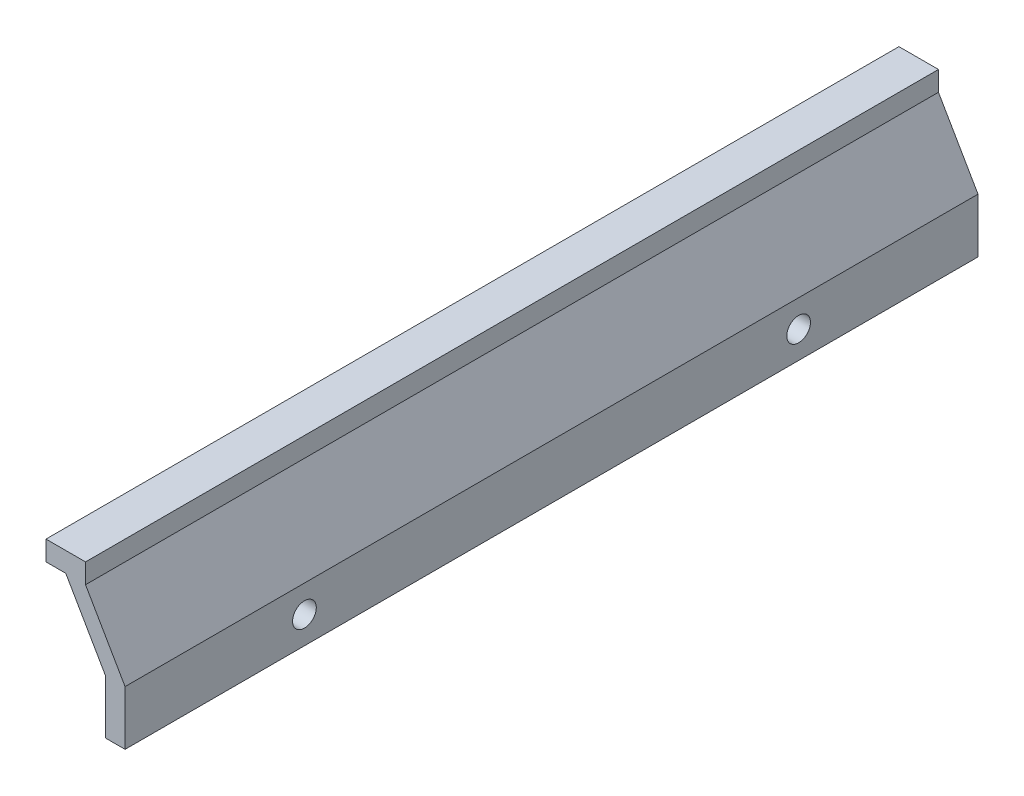
ISO-10303-21;
HEADER;
FILE_DESCRIPTION(('STEP AP214'),'2;1');
FILE_NAME('part.step','',(''),(''),'','','');
FILE_SCHEMA(('AUTOMOTIVE_DESIGN { 1 0 10303 214 1 1 1 1 }'));
ENDSEC;
DATA;
#1=APPLICATION_CONTEXT('core data for automotive mechanical design processes');
#2=APPLICATION_PROTOCOL_DEFINITION('international standard','automotive_design',2000,#1);
#3=PRODUCT_CONTEXT('',#1,'mechanical');
#4=PRODUCT('Part','Part','',(#3));
#5=PRODUCT_RELATED_PRODUCT_CATEGORY('part','',(#4));
#6=PRODUCT_DEFINITION_FORMATION('','',#4);
#7=PRODUCT_DEFINITION_CONTEXT('part definition',#1,'design');
#8=PRODUCT_DEFINITION('design','',#6,#7);
#9=PRODUCT_DEFINITION_SHAPE('','',#8);
#10=(LENGTH_UNIT() NAMED_UNIT(*) SI_UNIT(.MILLI.,.METRE.));
#11=(NAMED_UNIT(*) PLANE_ANGLE_UNIT() SI_UNIT($,.RADIAN.));
#12=(NAMED_UNIT(*) SI_UNIT($,.STERADIAN.) SOLID_ANGLE_UNIT());
#13=UNCERTAINTY_MEASURE_WITH_UNIT(LENGTH_MEASURE(1.E-05),#10,'distance_accuracy_value','');
#14=(GEOMETRIC_REPRESENTATION_CONTEXT(3) GLOBAL_UNCERTAINTY_ASSIGNED_CONTEXT((#13)) GLOBAL_UNIT_ASSIGNED_CONTEXT((#10,
#11,#12)) REPRESENTATION_CONTEXT('',''));
#15=CARTESIAN_POINT('',(0.,0.,0.));
#16=DIRECTION('',(0.,0.,1.));
#17=DIRECTION('',(1.,0.,0.));
#18=AXIS2_PLACEMENT_3D('',#15,#16,#17);
#19=CARTESIAN_POINT('',(-1.,-2.75,86.3));
#20=DIRECTION('',(1.,0.,0.));
#21=DIRECTION('',(0.,0.,-1.));
#22=AXIS2_PLACEMENT_3D('',#19,#20,#21);
#23=PLANE('',#22);
#24=CARTESIAN_POINT('',(-1.,0.,68.15));
#25=DIRECTION('',(1.,0.,0.));
#26=DIRECTION('',(0.,0.,-1.));
#27=AXIS2_PLACEMENT_3D('',#24,#25,#26);
#28=CIRCLE('',#27,1.2);
#29=CARTESIAN_POINT('',(-1.,0.,66.95));
#30=VERTEX_POINT('',#29);
#31=EDGE_CURVE('E138',#30,#30,#28,.T.);
#32=ORIENTED_EDGE('',*,*,#31,.T.);
#33=EDGE_LOOP('',(#32));
#34=FACE_BOUND('',#33,.T.);
#35=CARTESIAN_POINT('',(-1.,0.,18.15));
#36=DIRECTION('',(1.,0.,0.));
#37=DIRECTION('',(0.,0.,-1.));
#38=AXIS2_PLACEMENT_3D('',#35,#36,#37);
#39=CIRCLE('',#38,1.2);
#40=CARTESIAN_POINT('',(-1.,0.,16.95));
#41=VERTEX_POINT('',#40);
#42=EDGE_CURVE('E194',#41,#41,#39,.T.);
#43=ORIENTED_EDGE('',*,*,#42,.T.);
#44=EDGE_LOOP('',(#43));
#45=FACE_BOUND('',#44,.T.);
#46=DIRECTION('',(0.,-1.,0.));
#47=VECTOR('',#46,1.);
#48=CARTESIAN_POINT('',(-1.,-2.75,0.));
#49=LINE('',#48,#47);
#50=CARTESIAN_POINT('',(-1.,2.75,0.));
#51=VERTEX_POINT('',#50);
#52=CARTESIAN_POINT('',(-1.,-2.75,0.));
#53=VERTEX_POINT('',#52);
#54=EDGE_CURVE('E134',#51,#53,#49,.T.);
#55=ORIENTED_EDGE('',*,*,#54,.T.);
#56=DIRECTION('',(0.,0.,-1.));
#57=VECTOR('',#56,1.);
#58=CARTESIAN_POINT('',(-1.,-2.75,86.3));
#59=LINE('',#58,#57);
#60=CARTESIAN_POINT('',(-1.,-2.75,86.3));
#61=VERTEX_POINT('',#60);
#62=EDGE_CURVE('E11',#61,#53,#59,.T.);
#63=ORIENTED_EDGE('',*,*,#62,.F.);
#64=DIRECTION('',(0.,-1.,0.));
#65=VECTOR('',#64,1.);
#66=CARTESIAN_POINT('',(-1.,-2.75,86.3));
#67=LINE('',#66,#65);
#68=CARTESIAN_POINT('',(-1.,2.75,86.3));
#69=VERTEX_POINT('',#68);
#70=EDGE_CURVE('E152',#69,#61,#67,.T.);
#71=ORIENTED_EDGE('',*,*,#70,.F.);
#72=DIRECTION('',(0.,0.,-1.));
#73=VECTOR('',#72,1.);
#74=CARTESIAN_POINT('',(-1.,2.75,86.3));
#75=LINE('',#74,#73);
#76=EDGE_CURVE('E130',#69,#51,#75,.T.);
#77=ORIENTED_EDGE('',*,*,#76,.T.);
#78=EDGE_LOOP('',(#55,#63,#71,#77));
#79=FACE_BOUND('',#78,.T.);
#80=ADVANCED_FACE('F32',(#34,#45,#79),#23,.F.);
#81=CARTESIAN_POINT('',(1.,-2.75,86.3));
#82=DIRECTION('',(0.,1.,0.));
#83=DIRECTION('',(-1.,0.,0.));
#84=AXIS2_PLACEMENT_3D('',#81,#82,#83);
#85=PLANE('',#84);
#86=DIRECTION('',(1.,0.,0.));
#87=VECTOR('',#86,1.);
#88=CARTESIAN_POINT('',(1.,-2.75,0.));
#89=LINE('',#88,#87);
#90=CARTESIAN_POINT('',(1.,-2.75,0.));
#91=VERTEX_POINT('',#90);
#92=EDGE_CURVE('E137',#53,#91,#89,.T.);
#93=ORIENTED_EDGE('',*,*,#92,.T.);
#94=DIRECTION('',(0.,0.,-1.));
#95=VECTOR('',#94,1.);
#96=CARTESIAN_POINT('',(1.,-2.75,86.3));
#97=LINE('',#96,#95);
#98=CARTESIAN_POINT('',(1.,-2.75,86.3));
#99=VERTEX_POINT('',#98);
#100=EDGE_CURVE('E40',#99,#91,#97,.T.);
#101=ORIENTED_EDGE('',*,*,#100,.F.);
#102=DIRECTION('',(1.,0.,0.));
#103=VECTOR('',#102,1.);
#104=CARTESIAN_POINT('',(1.,-2.75,86.3));
#105=LINE('',#104,#103);
#106=EDGE_CURVE('E94',#61,#99,#105,.T.);
#107=ORIENTED_EDGE('',*,*,#106,.F.);
#108=ORIENTED_EDGE('',*,*,#62,.T.);
#109=EDGE_LOOP('',(#93,#101,#107,#108));
#110=FACE_BOUND('',#109,.T.);
#111=ADVANCED_FACE('F209',(#110),#85,.F.);
#112=CARTESIAN_POINT('',(1.,-2.75,86.3));
#113=DIRECTION('',(-1.,0.,0.));
#114=DIRECTION('',(0.,0.,1.));
#115=AXIS2_PLACEMENT_3D('',#112,#113,#114);
#116=PLANE('',#115);
#117=CARTESIAN_POINT('',(1.,0.,68.15));
#118=DIRECTION('',(1.,0.,0.));
#119=DIRECTION('',(0.,0.,-1.));
#120=AXIS2_PLACEMENT_3D('',#117,#118,#119);
#121=CIRCLE('',#120,1.2);
#122=CARTESIAN_POINT('',(1.,0.,66.95));
#123=VERTEX_POINT('',#122);
#124=EDGE_CURVE('E197',#123,#123,#121,.T.);
#125=ORIENTED_EDGE('',*,*,#124,.F.);
#126=EDGE_LOOP('',(#125));
#127=FACE_BOUND('',#126,.T.);
#128=CARTESIAN_POINT('',(1.,0.,18.15));
#129=DIRECTION('',(1.,0.,0.));
#130=DIRECTION('',(0.,0.,-1.));
#131=AXIS2_PLACEMENT_3D('',#128,#129,#130);
#132=CIRCLE('',#131,1.2);
#133=CARTESIAN_POINT('',(1.,0.,16.95));
#134=VERTEX_POINT('',#133);
#135=EDGE_CURVE('E198',#134,#134,#132,.T.);
#136=ORIENTED_EDGE('',*,*,#135,.F.);
#137=EDGE_LOOP('',(#136));
#138=FACE_BOUND('',#137,.T.);
#139=DIRECTION('',(0.,1.,0.));
#140=VECTOR('',#139,1.);
#141=CARTESIAN_POINT('',(1.,-2.75,0.));
#142=LINE('',#141,#140);
#143=CARTESIAN_POINT('',(1.,2.75,0.));
#144=VERTEX_POINT('',#143);
#145=EDGE_CURVE('E140',#91,#144,#142,.T.);
#146=ORIENTED_EDGE('',*,*,#145,.T.);
#147=DIRECTION('',(0.,0.,-1.));
#148=VECTOR('',#147,1.);
#149=CARTESIAN_POINT('',(1.,2.75,86.3));
#150=LINE('',#149,#148);
#151=CARTESIAN_POINT('',(1.,2.75,86.3));
#152=VERTEX_POINT('',#151);
#153=EDGE_CURVE('E162',#152,#144,#150,.T.);
#154=ORIENTED_EDGE('',*,*,#153,.F.);
#155=DIRECTION('',(0.,1.,0.));
#156=VECTOR('',#155,1.);
#157=CARTESIAN_POINT('',(1.,-2.75,86.3));
#158=LINE('',#157,#156);
#159=EDGE_CURVE('E170',#99,#152,#158,.T.);
#160=ORIENTED_EDGE('',*,*,#159,.F.);
#161=ORIENTED_EDGE('',*,*,#100,.T.);
#162=EDGE_LOOP('',(#146,#154,#160,#161));
#163=FACE_BOUND('',#162,.T.);
#164=ADVANCED_FACE('F168',(#127,#138,#163),#116,.F.);
#165=CARTESIAN_POINT('',(-2.99999999999996,9.67820323027554,86.3));
#166=DIRECTION('',(-0.866025403784442,-0.499999999999995,0.));
#167=DIRECTION('',(0.499999999999995,-0.866025403784442,0.));
#168=AXIS2_PLACEMENT_3D('',#165,#166,#167);
#169=PLANE('',#168);
#170=DIRECTION('',(-0.499999999999995,0.866025403784441,0.));
#171=VECTOR('',#170,1.);
#172=CARTESIAN_POINT('',(-2.99999999999996,9.67820323027554,0.));
#173=LINE('',#172,#171);
#174=CARTESIAN_POINT('',(-2.99999999999996,9.67820323027554,0.));
#175=VERTEX_POINT('',#174);
#176=EDGE_CURVE('E142',#144,#175,#173,.T.);
#177=ORIENTED_EDGE('',*,*,#176,.T.);
#178=DIRECTION('',(0.,0.,-1.));
#179=VECTOR('',#178,1.);
#180=CARTESIAN_POINT('',(-2.99999999999996,9.67820323027554,86.3));
#181=LINE('',#180,#179);
#182=CARTESIAN_POINT('',(-2.99999999999996,9.67820323027554,86.3));
#183=VERTEX_POINT('',#182);
#184=EDGE_CURVE('E159',#183,#175,#181,.T.);
#185=ORIENTED_EDGE('',*,*,#184,.F.);
#186=DIRECTION('',(-0.499999999999995,0.866025403784441,0.));
#187=VECTOR('',#186,1.);
#188=CARTESIAN_POINT('',(-2.99999999999996,9.67820323027554,86.3));
#189=LINE('',#188,#187);
#190=EDGE_CURVE('E185',#152,#183,#189,.T.);
#191=ORIENTED_EDGE('',*,*,#190,.F.);
#192=ORIENTED_EDGE('',*,*,#153,.T.);
#193=EDGE_LOOP('',(#177,#185,#191,#192));
#194=FACE_BOUND('',#193,.T.);
#195=ADVANCED_FACE('F178',(#194),#169,.F.);
#196=CARTESIAN_POINT('',(-2.99999999999996,11.6782032302755,86.3));
#197=DIRECTION('',(-1.,0.,0.));
#198=DIRECTION('',(0.,0.,1.));
#199=AXIS2_PLACEMENT_3D('',#196,#197,#198);
#200=PLANE('',#199);
#201=DIRECTION('',(0.,1.,0.));
#202=VECTOR('',#201,1.);
#203=CARTESIAN_POINT('',(-2.99999999999996,11.6782032302755,0.));
#204=LINE('',#203,#202);
#205=CARTESIAN_POINT('',(-2.99999999999996,11.6782032302755,0.));
#206=VERTEX_POINT('',#205);
#207=EDGE_CURVE('E144',#175,#206,#204,.T.);
#208=ORIENTED_EDGE('',*,*,#207,.T.);
#209=DIRECTION('',(0.,0.,-1.));
#210=VECTOR('',#209,1.);
#211=CARTESIAN_POINT('',(-2.99999999999996,11.6782032302755,86.3));
#212=LINE('',#211,#210);
#213=CARTESIAN_POINT('',(-2.99999999999996,11.6782032302755,86.3));
#214=VERTEX_POINT('',#213);
#215=EDGE_CURVE('E156',#214,#206,#212,.T.);
#216=ORIENTED_EDGE('',*,*,#215,.F.);
#217=DIRECTION('',(0.,1.,0.));
#218=VECTOR('',#217,1.);
#219=CARTESIAN_POINT('',(-2.99999999999996,11.6782032302755,86.3));
#220=LINE('',#219,#218);
#221=EDGE_CURVE('E184',#183,#214,#220,.T.);
#222=ORIENTED_EDGE('',*,*,#221,.F.);
#223=ORIENTED_EDGE('',*,*,#184,.T.);
#224=EDGE_LOOP('',(#208,#216,#222,#223));
#225=FACE_BOUND('',#224,.T.);
#226=ADVANCED_FACE('F182',(#225),#200,.F.);
#227=CARTESIAN_POINT('',(-6.99999999999996,11.6782032302755,86.3));
#228=DIRECTION('',(0.,-1.,0.));
#229=DIRECTION('',(0.,0.,-1.));
#230=AXIS2_PLACEMENT_3D('',#227,#228,#229);
#231=PLANE('',#230);
#232=DIRECTION('',(-1.,0.,0.));
#233=VECTOR('',#232,1.);
#234=CARTESIAN_POINT('',(-6.99999999999996,11.6782032302755,0.));
#235=LINE('',#234,#233);
#236=CARTESIAN_POINT('',(-6.99999999999996,11.6782032302755,0.));
#237=VERTEX_POINT('',#236);
#238=EDGE_CURVE('E147',#206,#237,#235,.T.);
#239=ORIENTED_EDGE('',*,*,#238,.T.);
#240=DIRECTION('',(0.,0.,-1.));
#241=VECTOR('',#240,1.);
#242=CARTESIAN_POINT('',(-6.99999999999996,11.6782032302755,86.3));
#243=LINE('',#242,#241);
#244=CARTESIAN_POINT('',(-6.99999999999996,11.6782032302755,86.3));
#245=VERTEX_POINT('',#244);
#246=EDGE_CURVE('E125',#245,#237,#243,.T.);
#247=ORIENTED_EDGE('',*,*,#246,.F.);
#248=DIRECTION('',(-1.,0.,0.));
#249=VECTOR('',#248,1.);
#250=CARTESIAN_POINT('',(-2.99999999999996,11.6782032302755,86.3));
#251=LINE('',#250,#249);
#252=EDGE_CURVE('E116',#214,#245,#251,.T.);
#253=ORIENTED_EDGE('',*,*,#252,.F.);
#254=ORIENTED_EDGE('',*,*,#215,.T.);
#255=EDGE_LOOP('',(#239,#247,#253,#254));
#256=FACE_BOUND('',#255,.T.);
#257=ADVANCED_FACE('F225',(#256),#231,.F.);
#258=CARTESIAN_POINT('',(-6.99999999999996,9.67820323027554,86.3));
#259=DIRECTION('',(1.,0.,0.));
#260=DIRECTION('',(0.,1.,0.));
#261=AXIS2_PLACEMENT_3D('',#258,#259,#260);
#262=PLANE('',#261);
#263=DIRECTION('',(0.,-1.,0.));
#264=VECTOR('',#263,1.);
#265=CARTESIAN_POINT('',(-6.99999999999996,9.67820323027554,0.));
#266=LINE('',#265,#264);
#267=CARTESIAN_POINT('',(-6.99999999999996,9.67820323027554,0.));
#268=VERTEX_POINT('',#267);
#269=EDGE_CURVE('E124',#237,#268,#266,.T.);
#270=ORIENTED_EDGE('',*,*,#269,.T.);
#271=DIRECTION('',(0.,0.,-1.));
#272=VECTOR('',#271,1.);
#273=CARTESIAN_POINT('',(-6.99999999999996,9.67820323027554,86.3));
#274=LINE('',#273,#272);
#275=CARTESIAN_POINT('',(-6.99999999999996,9.67820323027554,86.3));
#276=VERTEX_POINT('',#275);
#277=EDGE_CURVE('E121',#276,#268,#274,.T.);
#278=ORIENTED_EDGE('',*,*,#277,.F.);
#279=DIRECTION('',(0.,-1.,0.));
#280=VECTOR('',#279,1.);
#281=CARTESIAN_POINT('',(-6.99999999999996,9.67820323027554,86.3));
#282=LINE('',#281,#280);
#283=EDGE_CURVE('E110',#245,#276,#282,.T.);
#284=ORIENTED_EDGE('',*,*,#283,.F.);
#285=ORIENTED_EDGE('',*,*,#246,.T.);
#286=EDGE_LOOP('',(#270,#278,#284,#285));
#287=FACE_BOUND('',#286,.T.);
#288=ADVANCED_FACE('F122',(#287),#262,.F.);
#289=CARTESIAN_POINT('',(-4.99999999999996,9.67820323027554,86.3));
#290=DIRECTION('',(0.,1.,0.));
#291=DIRECTION('',(0.,0.,1.));
#292=AXIS2_PLACEMENT_3D('',#289,#290,#291);
#293=PLANE('',#292);
#294=DIRECTION('',(1.,0.,0.));
#295=VECTOR('',#294,1.);
#296=CARTESIAN_POINT('',(-4.99999999999996,9.67820323027554,0.));
#297=LINE('',#296,#295);
#298=CARTESIAN_POINT('',(-4.99999999999996,9.67820323027554,0.));
#299=VERTEX_POINT('',#298);
#300=EDGE_CURVE('E80',#268,#299,#297,.T.);
#301=ORIENTED_EDGE('',*,*,#300,.T.);
#302=DIRECTION('',(0.,0.,-1.));
#303=VECTOR('',#302,1.);
#304=CARTESIAN_POINT('',(-4.99999999999996,9.67820323027554,86.3));
#305=LINE('',#304,#303);
#306=CARTESIAN_POINT('',(-4.99999999999996,9.67820323027554,86.3));
#307=VERTEX_POINT('',#306);
#308=EDGE_CURVE('E126',#307,#299,#305,.T.);
#309=ORIENTED_EDGE('',*,*,#308,.F.);
#310=DIRECTION('',(1.,0.,0.));
#311=VECTOR('',#310,1.);
#312=CARTESIAN_POINT('',(-4.99999999999996,9.67820323027554,86.3));
#313=LINE('',#312,#311);
#314=EDGE_CURVE('E114',#276,#307,#313,.T.);
#315=ORIENTED_EDGE('',*,*,#314,.F.);
#316=ORIENTED_EDGE('',*,*,#277,.T.);
#317=EDGE_LOOP('',(#301,#309,#315,#316));
#318=FACE_BOUND('',#317,.T.);
#319=ADVANCED_FACE('F128',(#318),#293,.F.);
#320=CARTESIAN_POINT('',(-4.99999999999996,9.67820323027554,86.3));
#321=DIRECTION('',(0.866025403784441,0.499999999999995,0.));
#322=DIRECTION('',(-0.499999999999995,0.866025403784442,0.));
#323=AXIS2_PLACEMENT_3D('',#320,#321,#322);
#324=PLANE('',#323);
#325=DIRECTION('',(0.499999999999995,-0.866025403784442,0.));
#326=VECTOR('',#325,1.);
#327=CARTESIAN_POINT('',(-4.99999999999996,9.67820323027554,0.));
#328=LINE('',#327,#326);
#329=EDGE_CURVE('E86',#299,#51,#328,.T.);
#330=ORIENTED_EDGE('',*,*,#329,.T.);
#331=ORIENTED_EDGE('',*,*,#76,.F.);
#332=DIRECTION('',(0.499999999999995,-0.866025403784442,0.));
#333=VECTOR('',#332,1.);
#334=CARTESIAN_POINT('',(-4.99999999999996,9.67820323027554,86.3));
#335=LINE('',#334,#333);
#336=EDGE_CURVE('E48',#307,#69,#335,.T.);
#337=ORIENTED_EDGE('',*,*,#336,.F.);
#338=ORIENTED_EDGE('',*,*,#308,.T.);
#339=EDGE_LOOP('',(#330,#331,#337,#338));
#340=FACE_BOUND('',#339,.T.);
#341=ADVANCED_FACE('F275',(#340),#324,.F.);
#342=CARTESIAN_POINT('',(0.,0.,86.3));
#343=DIRECTION('',(0.,0.,1.));
#344=DIRECTION('',(1.,0.,0.));
#345=AXIS2_PLACEMENT_3D('',#342,#343,#344);
#346=PLANE('',#345);
#347=ORIENTED_EDGE('',*,*,#70,.T.);
#348=ORIENTED_EDGE('',*,*,#106,.T.);
#349=ORIENTED_EDGE('',*,*,#159,.T.);
#350=ORIENTED_EDGE('',*,*,#190,.T.);
#351=ORIENTED_EDGE('',*,*,#221,.T.);
#352=ORIENTED_EDGE('',*,*,#252,.T.);
#353=ORIENTED_EDGE('',*,*,#283,.T.);
#354=ORIENTED_EDGE('',*,*,#314,.T.);
#355=ORIENTED_EDGE('',*,*,#336,.T.);
#356=EDGE_LOOP('',(#347,#348,#349,#350,#351,#352,#353,#354,#355));
#357=FACE_BOUND('',#356,.T.);
#358=ADVANCED_FACE('F112',(#357),#346,.T.);
#359=CARTESIAN_POINT('',(0.,0.,0.));
#360=DIRECTION('',(0.,0.,1.));
#361=DIRECTION('',(1.,0.,0.));
#362=AXIS2_PLACEMENT_3D('',#359,#360,#361);
#363=PLANE('',#362);
#364=ORIENTED_EDGE('',*,*,#54,.F.);
#365=ORIENTED_EDGE('',*,*,#329,.F.);
#366=ORIENTED_EDGE('',*,*,#300,.F.);
#367=ORIENTED_EDGE('',*,*,#269,.F.);
#368=ORIENTED_EDGE('',*,*,#238,.F.);
#369=ORIENTED_EDGE('',*,*,#207,.F.);
#370=ORIENTED_EDGE('',*,*,#176,.F.);
#371=ORIENTED_EDGE('',*,*,#145,.F.);
#372=ORIENTED_EDGE('',*,*,#92,.F.);
#373=EDGE_LOOP('',(#364,#365,#366,#367,#368,#369,#370,#371,#372));
#374=FACE_BOUND('',#373,.T.);
#375=ADVANCED_FACE('F174',(#374),#363,.F.);
#376=CARTESIAN_POINT('',(-6.99999999999996,0.,18.15));
#377=DIRECTION('',(1.,0.,0.));
#378=DIRECTION('',(0.,0.,-1.));
#379=AXIS2_PLACEMENT_3D('',#376,#377,#378);
#380=CYLINDRICAL_SURFACE('',#379,1.2);
#381=ORIENTED_EDGE('',*,*,#135,.T.);
#382=EDGE_LOOP('',(#381));
#383=FACE_BOUND('',#382,.T.);
#384=ORIENTED_EDGE('',*,*,#42,.F.);
#385=EDGE_LOOP('',(#384));
#386=FACE_BOUND('',#385,.T.);
#387=ADVANCED_FACE('F213',(#383,#386),#380,.F.);
#388=CARTESIAN_POINT('',(-6.99999999999996,0.,68.15));
#389=DIRECTION('',(1.,0.,0.));
#390=DIRECTION('',(0.,0.,-1.));
#391=AXIS2_PLACEMENT_3D('',#388,#389,#390);
#392=CYLINDRICAL_SURFACE('',#391,1.2);
#393=ORIENTED_EDGE('',*,*,#124,.T.);
#394=EDGE_LOOP('',(#393));
#395=FACE_BOUND('',#394,.T.);
#396=ORIENTED_EDGE('',*,*,#31,.F.);
#397=EDGE_LOOP('',(#396));
#398=FACE_BOUND('',#397,.T.);
#399=ADVANCED_FACE('F204',(#395,#398),#392,.F.);
#400=CLOSED_SHELL('',(#80,#111,#164,#195,#226,#257,#288,#319,#341,#358,#375,#387,#399));
#401=MANIFOLD_SOLID_BREP('B2',#400);
#402=ADVANCED_BREP_SHAPE_REPRESENTATION('',(#18,#401),#14);
#403=SHAPE_DEFINITION_REPRESENTATION(#9,#402);
ENDSEC;
END-ISO-10303-21;
